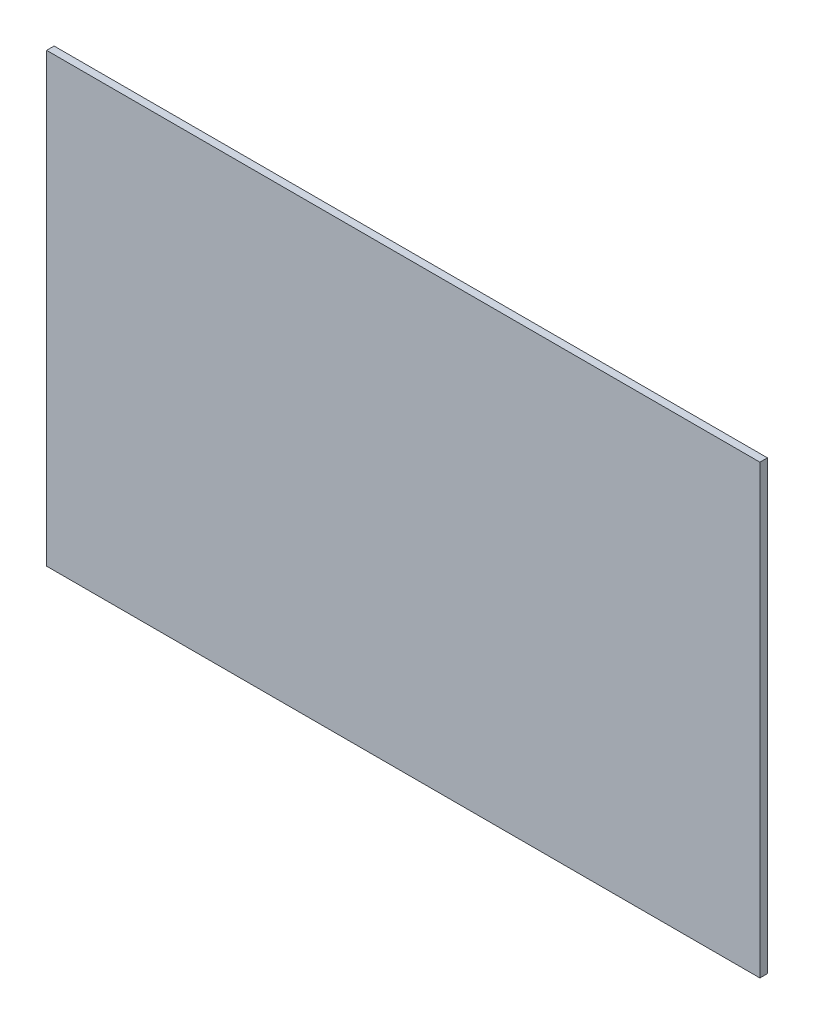
ISO-10303-21;
HEADER;
FILE_DESCRIPTION(('STEP AP214'),'2;1');
FILE_NAME('part.step','',(''),(''),'','','');
FILE_SCHEMA(('AUTOMOTIVE_DESIGN { 1 0 10303 214 1 1 1 1 }'));
ENDSEC;
DATA;
#1=APPLICATION_CONTEXT('core data for automotive mechanical design processes');
#2=APPLICATION_PROTOCOL_DEFINITION('international standard','automotive_design',2000,#1);
#3=PRODUCT_CONTEXT('',#1,'mechanical');
#4=PRODUCT('Part','Part','',(#3));
#5=PRODUCT_RELATED_PRODUCT_CATEGORY('part','',(#4));
#6=PRODUCT_DEFINITION_FORMATION('','',#4);
#7=PRODUCT_DEFINITION_CONTEXT('part definition',#1,'design');
#8=PRODUCT_DEFINITION('design','',#6,#7);
#9=PRODUCT_DEFINITION_SHAPE('','',#8);
#10=(LENGTH_UNIT() NAMED_UNIT(*) SI_UNIT(.MILLI.,.METRE.));
#11=(NAMED_UNIT(*) PLANE_ANGLE_UNIT() SI_UNIT($,.RADIAN.));
#12=(NAMED_UNIT(*) SI_UNIT($,.STERADIAN.) SOLID_ANGLE_UNIT());
#13=UNCERTAINTY_MEASURE_WITH_UNIT(LENGTH_MEASURE(1.E-05),#10,'distance_accuracy_value','');
#14=(GEOMETRIC_REPRESENTATION_CONTEXT(3) GLOBAL_UNCERTAINTY_ASSIGNED_CONTEXT((#13)) GLOBAL_UNIT_ASSIGNED_CONTEXT((#10,
#11,#12)) REPRESENTATION_CONTEXT('',''));
#15=CARTESIAN_POINT('',(0.,0.,0.));
#16=DIRECTION('',(0.,0.,1.));
#17=DIRECTION('',(1.,0.,0.));
#18=AXIS2_PLACEMENT_3D('',#15,#16,#17);
#19=CARTESIAN_POINT('',(475.,297.5,10.));
#20=DIRECTION('',(-1.,0.,0.));
#21=DIRECTION('',(0.,-1.,0.));
#22=AXIS2_PLACEMENT_3D('',#19,#20,#21);
#23=PLANE('',#22);
#24=DIRECTION('',(0.,1.,0.));
#25=VECTOR('',#24,1.);
#26=CARTESIAN_POINT('',(475.,297.5,0.));
#27=LINE('',#26,#25);
#28=CARTESIAN_POINT('',(475.,-297.5,0.));
#29=VERTEX_POINT('',#28);
#30=CARTESIAN_POINT('',(475.,297.5,0.));
#31=VERTEX_POINT('',#30);
#32=EDGE_CURVE('E100',#29,#31,#27,.T.);
#33=ORIENTED_EDGE('',*,*,#32,.T.);
#34=DIRECTION('',(0.,0.,-1.));
#35=VECTOR('',#34,1.);
#36=CARTESIAN_POINT('',(475.,297.5,10.));
#37=LINE('',#36,#35);
#38=CARTESIAN_POINT('',(475.,297.5,10.));
#39=VERTEX_POINT('',#38);
#40=EDGE_CURVE('E11',#39,#31,#37,.T.);
#41=ORIENTED_EDGE('',*,*,#40,.F.);
#42=DIRECTION('',(0.,1.,0.));
#43=VECTOR('',#42,1.);
#44=CARTESIAN_POINT('',(475.,297.5,10.));
#45=LINE('',#44,#43);
#46=CARTESIAN_POINT('',(475.,-297.5,10.));
#47=VERTEX_POINT('',#46);
#48=EDGE_CURVE('E88',#47,#39,#45,.T.);
#49=ORIENTED_EDGE('',*,*,#48,.F.);
#50=DIRECTION('',(0.,0.,-1.));
#51=VECTOR('',#50,1.);
#52=CARTESIAN_POINT('',(475.,-297.5,10.));
#53=LINE('',#52,#51);
#54=EDGE_CURVE('E96',#47,#29,#53,.T.);
#55=ORIENTED_EDGE('',*,*,#54,.T.);
#56=EDGE_LOOP('',(#33,#41,#49,#55));
#57=FACE_BOUND('',#56,.T.);
#58=ADVANCED_FACE('F37',(#57),#23,.F.);
#59=CARTESIAN_POINT('',(-475.,297.5,10.));
#60=DIRECTION('',(0.,-1.,0.));
#61=DIRECTION('',(0.,0.,-1.));
#62=AXIS2_PLACEMENT_3D('',#59,#60,#61);
#63=PLANE('',#62);
#64=DIRECTION('',(-1.,0.,0.));
#65=VECTOR('',#64,1.);
#66=CARTESIAN_POINT('',(-475.,297.5,0.));
#67=LINE('',#66,#65);
#68=CARTESIAN_POINT('',(-475.,297.5,0.));
#69=VERTEX_POINT('',#68);
#70=EDGE_CURVE('E92',#31,#69,#67,.T.);
#71=ORIENTED_EDGE('',*,*,#70,.T.);
#72=DIRECTION('',(0.,0.,-1.));
#73=VECTOR('',#72,1.);
#74=CARTESIAN_POINT('',(-475.,297.5,10.));
#75=LINE('',#74,#73);
#76=CARTESIAN_POINT('',(-475.,297.5,10.));
#77=VERTEX_POINT('',#76);
#78=EDGE_CURVE('E45',#77,#69,#75,.T.);
#79=ORIENTED_EDGE('',*,*,#78,.F.);
#80=DIRECTION('',(-1.,0.,0.));
#81=VECTOR('',#80,1.);
#82=CARTESIAN_POINT('',(-475.,297.5,10.));
#83=LINE('',#82,#81);
#84=EDGE_CURVE('E83',#39,#77,#83,.T.);
#85=ORIENTED_EDGE('',*,*,#84,.F.);
#86=ORIENTED_EDGE('',*,*,#40,.T.);
#87=EDGE_LOOP('',(#71,#79,#85,#86));
#88=FACE_BOUND('',#87,.T.);
#89=ADVANCED_FACE('F91',(#88),#63,.F.);
#90=CARTESIAN_POINT('',(-475.,297.5,10.));
#91=DIRECTION('',(1.,0.,0.));
#92=DIRECTION('',(0.,1.,0.));
#93=AXIS2_PLACEMENT_3D('',#90,#91,#92);
#94=PLANE('',#93);
#95=DIRECTION('',(0.,-1.,0.));
#96=VECTOR('',#95,1.);
#97=CARTESIAN_POINT('',(-475.,297.5,0.));
#98=LINE('',#97,#96);
#99=CARTESIAN_POINT('',(-475.,-297.5,0.));
#100=VERTEX_POINT('',#99);
#101=EDGE_CURVE('E70',#69,#100,#98,.T.);
#102=ORIENTED_EDGE('',*,*,#101,.T.);
#103=DIRECTION('',(0.,0.,-1.));
#104=VECTOR('',#103,1.);
#105=CARTESIAN_POINT('',(-475.,-297.5,10.));
#106=LINE('',#105,#104);
#107=CARTESIAN_POINT('',(-475.,-297.5,10.));
#108=VERTEX_POINT('',#107);
#109=EDGE_CURVE('E93',#108,#100,#106,.T.);
#110=ORIENTED_EDGE('',*,*,#109,.F.);
#111=DIRECTION('',(0.,-1.,0.));
#112=VECTOR('',#111,1.);
#113=CARTESIAN_POINT('',(-475.,297.5,10.));
#114=LINE('',#113,#112);
#115=EDGE_CURVE('E86',#77,#108,#114,.T.);
#116=ORIENTED_EDGE('',*,*,#115,.F.);
#117=ORIENTED_EDGE('',*,*,#78,.T.);
#118=EDGE_LOOP('',(#102,#110,#116,#117));
#119=FACE_BOUND('',#118,.T.);
#120=ADVANCED_FACE('F94',(#119),#94,.F.);
#121=CARTESIAN_POINT('',(-475.,-297.5,10.));
#122=DIRECTION('',(0.,1.,0.));
#123=DIRECTION('',(0.,0.,1.));
#124=AXIS2_PLACEMENT_3D('',#121,#122,#123);
#125=PLANE('',#124);
#126=DIRECTION('',(1.,0.,0.));
#127=VECTOR('',#126,1.);
#128=CARTESIAN_POINT('',(-475.,-297.5,0.));
#129=LINE('',#128,#127);
#130=EDGE_CURVE('E76',#100,#29,#129,.T.);
#131=ORIENTED_EDGE('',*,*,#130,.T.);
#132=ORIENTED_EDGE('',*,*,#54,.F.);
#133=DIRECTION('',(1.,0.,0.));
#134=VECTOR('',#133,1.);
#135=CARTESIAN_POINT('',(-475.,-297.5,10.));
#136=LINE('',#135,#134);
#137=EDGE_CURVE('E53',#108,#47,#136,.T.);
#138=ORIENTED_EDGE('',*,*,#137,.F.);
#139=ORIENTED_EDGE('',*,*,#109,.T.);
#140=EDGE_LOOP('',(#131,#132,#138,#139));
#141=FACE_BOUND('',#140,.T.);
#142=ADVANCED_FACE('F107',(#141),#125,.F.);
#143=CARTESIAN_POINT('',(0.,0.,10.));
#144=DIRECTION('',(0.,0.,1.));
#145=DIRECTION('',(1.,0.,0.));
#146=AXIS2_PLACEMENT_3D('',#143,#144,#145);
#147=PLANE('',#146);
#148=ORIENTED_EDGE('',*,*,#48,.T.);
#149=ORIENTED_EDGE('',*,*,#84,.T.);
#150=ORIENTED_EDGE('',*,*,#115,.T.);
#151=ORIENTED_EDGE('',*,*,#137,.T.);
#152=EDGE_LOOP('',(#148,#149,#150,#151));
#153=FACE_BOUND('',#152,.T.);
#154=ADVANCED_FACE('F84',(#153),#147,.T.);
#155=CARTESIAN_POINT('',(0.,0.,0.));
#156=DIRECTION('',(0.,0.,1.));
#157=DIRECTION('',(1.,0.,0.));
#158=AXIS2_PLACEMENT_3D('',#155,#156,#157);
#159=PLANE('',#158);
#160=ORIENTED_EDGE('',*,*,#32,.F.);
#161=ORIENTED_EDGE('',*,*,#130,.F.);
#162=ORIENTED_EDGE('',*,*,#101,.F.);
#163=ORIENTED_EDGE('',*,*,#70,.F.);
#164=EDGE_LOOP('',(#160,#161,#162,#163));
#165=FACE_BOUND('',#164,.T.);
#166=ADVANCED_FACE('F110',(#165),#159,.F.);
#167=CLOSED_SHELL('',(#58,#89,#120,#142,#154,#166));
#168=MANIFOLD_SOLID_BREP('B2',#167);
#169=ADVANCED_BREP_SHAPE_REPRESENTATION('',(#18,#168),#14);
#170=SHAPE_DEFINITION_REPRESENTATION(#9,#169);
ENDSEC;
END-ISO-10303-21;
